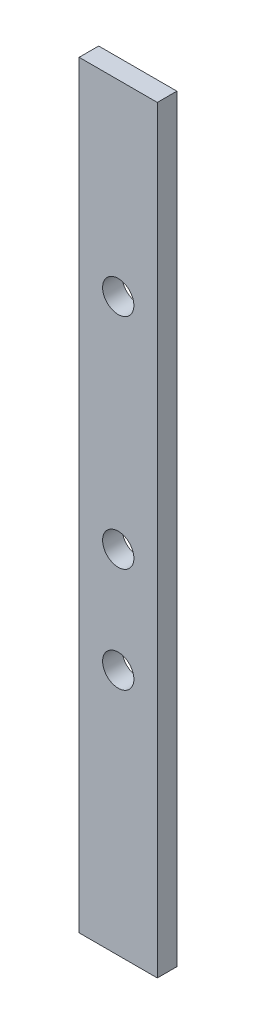
ISO-10303-21;
HEADER;
FILE_DESCRIPTION(('STEP AP214'),'2;1');
FILE_NAME('part.step','',(''),(''),'','','');
FILE_SCHEMA(('AUTOMOTIVE_DESIGN { 1 0 10303 214 1 1 1 1 }'));
ENDSEC;
DATA;
#1=APPLICATION_CONTEXT('core data for automotive mechanical design processes');
#2=APPLICATION_PROTOCOL_DEFINITION('international standard','automotive_design',2000,#1);
#3=PRODUCT_CONTEXT('',#1,'mechanical');
#4=PRODUCT('Part','Part','',(#3));
#5=PRODUCT_RELATED_PRODUCT_CATEGORY('part','',(#4));
#6=PRODUCT_DEFINITION_FORMATION('','',#4);
#7=PRODUCT_DEFINITION_CONTEXT('part definition',#1,'design');
#8=PRODUCT_DEFINITION('design','',#6,#7);
#9=PRODUCT_DEFINITION_SHAPE('','',#8);
#10=(LENGTH_UNIT() NAMED_UNIT(*) SI_UNIT(.MILLI.,.METRE.));
#11=(NAMED_UNIT(*) PLANE_ANGLE_UNIT() SI_UNIT($,.RADIAN.));
#12=(NAMED_UNIT(*) SI_UNIT($,.STERADIAN.) SOLID_ANGLE_UNIT());
#13=UNCERTAINTY_MEASURE_WITH_UNIT(LENGTH_MEASURE(1.E-05),#10,'distance_accuracy_value','');
#14=(GEOMETRIC_REPRESENTATION_CONTEXT(3) GLOBAL_UNCERTAINTY_ASSIGNED_CONTEXT((#13)) GLOBAL_UNIT_ASSIGNED_CONTEXT((#10,
#11,#12)) REPRESENTATION_CONTEXT('',''));
#15=CARTESIAN_POINT('',(0.,0.,0.));
#16=DIRECTION('',(0.,0.,1.));
#17=DIRECTION('',(1.,0.,0.));
#18=AXIS2_PLACEMENT_3D('',#15,#16,#17);
#19=CARTESIAN_POINT('',(0.,123.19,0.));
#20=DIRECTION('',(1.,0.,0.));
#21=DIRECTION('',(0.,0.,-1.));
#22=AXIS2_PLACEMENT_3D('',#19,#20,#21);
#23=PLANE('',#22);
#24=DIRECTION('',(0.,0.,1.));
#25=VECTOR('',#24,1.);
#26=CARTESIAN_POINT('',(0.,0.,0.));
#27=LINE('',#26,#25);
#28=CARTESIAN_POINT('',(0.,0.,-3.175));
#29=VERTEX_POINT('',#28);
#30=CARTESIAN_POINT('',(0.,0.,0.));
#31=VERTEX_POINT('',#30);
#32=EDGE_CURVE('E116',#29,#31,#27,.T.);
#33=ORIENTED_EDGE('',*,*,#32,.T.);
#34=DIRECTION('',(0.,-1.,0.));
#35=VECTOR('',#34,1.);
#36=CARTESIAN_POINT('',(0.,123.19,0.));
#37=LINE('',#36,#35);
#38=CARTESIAN_POINT('',(0.,123.19,0.));
#39=VERTEX_POINT('',#38);
#40=EDGE_CURVE('E11',#39,#31,#37,.T.);
#41=ORIENTED_EDGE('',*,*,#40,.F.);
#42=DIRECTION('',(0.,0.,1.));
#43=VECTOR('',#42,1.);
#44=CARTESIAN_POINT('',(0.,123.19,0.));
#45=LINE('',#44,#43);
#46=CARTESIAN_POINT('',(0.,123.19,-3.175));
#47=VERTEX_POINT('',#46);
#48=EDGE_CURVE('E99',#47,#39,#45,.T.);
#49=ORIENTED_EDGE('',*,*,#48,.F.);
#50=DIRECTION('',(0.,-1.,0.));
#51=VECTOR('',#50,1.);
#52=CARTESIAN_POINT('',(0.,123.19,-3.175));
#53=LINE('',#52,#51);
#54=EDGE_CURVE('E112',#47,#29,#53,.T.);
#55=ORIENTED_EDGE('',*,*,#54,.T.);
#56=EDGE_LOOP('',(#33,#41,#49,#55));
#57=FACE_BOUND('',#56,.T.);
#58=ADVANCED_FACE('F45',(#57),#23,.F.);
#59=CARTESIAN_POINT('',(0.,123.19,0.));
#60=DIRECTION('',(0.,0.,-1.));
#61=DIRECTION('',(-1.,0.,0.));
#62=AXIS2_PLACEMENT_3D('',#59,#60,#61);
#63=PLANE('',#62);
#64=CARTESIAN_POINT('',(6.35,92.71,0.));
#65=DIRECTION('',(0.,0.,1.));
#66=DIRECTION('',(1.,0.,0.));
#67=AXIS2_PLACEMENT_3D('',#64,#65,#66);
#68=CIRCLE('',#67,2.54);
#69=CARTESIAN_POINT('',(8.89,92.71,0.));
#70=VERTEX_POINT('',#69);
#71=EDGE_CURVE('E134',#70,#70,#68,.T.);
#72=ORIENTED_EDGE('',*,*,#71,.F.);
#73=EDGE_LOOP('',(#72));
#74=FACE_BOUND('',#73,.T.);
#75=CARTESIAN_POINT('',(6.35000000000002,57.15,0.));
#76=DIRECTION('',(0.,0.,1.));
#77=DIRECTION('',(1.,0.,0.));
#78=AXIS2_PLACEMENT_3D('',#75,#76,#77);
#79=CIRCLE('',#78,2.54);
#80=CARTESIAN_POINT('',(8.89000000000002,57.15,0.));
#81=VERTEX_POINT('',#80);
#82=EDGE_CURVE('E235',#81,#81,#79,.T.);
#83=ORIENTED_EDGE('',*,*,#82,.F.);
#84=EDGE_LOOP('',(#83));
#85=FACE_BOUND('',#84,.T.);
#86=CARTESIAN_POINT('',(6.35000000000002,40.132,0.));
#87=DIRECTION('',(0.,0.,1.));
#88=DIRECTION('',(1.,0.,0.));
#89=AXIS2_PLACEMENT_3D('',#86,#87,#88);
#90=CIRCLE('',#89,2.54);
#91=CARTESIAN_POINT('',(8.89000000000002,40.132,0.));
#92=VERTEX_POINT('',#91);
#93=EDGE_CURVE('E230',#92,#92,#90,.T.);
#94=ORIENTED_EDGE('',*,*,#93,.F.);
#95=EDGE_LOOP('',(#94));
#96=FACE_BOUND('',#95,.T.);
#97=DIRECTION('',(1.,0.,0.));
#98=VECTOR('',#97,1.);
#99=CARTESIAN_POINT('',(0.,0.,0.));
#100=LINE('',#99,#98);
#101=CARTESIAN_POINT('',(12.7,0.,0.));
#102=VERTEX_POINT('',#101);
#103=EDGE_CURVE('E104',#31,#102,#100,.T.);
#104=ORIENTED_EDGE('',*,*,#103,.T.);
#105=DIRECTION('',(0.,-1.,0.));
#106=VECTOR('',#105,1.);
#107=CARTESIAN_POINT('',(12.7,123.19,0.));
#108=LINE('',#107,#106);
#109=CARTESIAN_POINT('',(12.7,123.19,0.));
#110=VERTEX_POINT('',#109);
#111=EDGE_CURVE('E55',#110,#102,#108,.T.);
#112=ORIENTED_EDGE('',*,*,#111,.F.);
#113=DIRECTION('',(1.,0.,0.));
#114=VECTOR('',#113,1.);
#115=CARTESIAN_POINT('',(0.,123.19,0.));
#116=LINE('',#115,#114);
#117=EDGE_CURVE('E94',#39,#110,#116,.T.);
#118=ORIENTED_EDGE('',*,*,#117,.F.);
#119=ORIENTED_EDGE('',*,*,#40,.T.);
#120=EDGE_LOOP('',(#104,#112,#118,#119));
#121=FACE_BOUND('',#120,.T.);
#122=ADVANCED_FACE('F103',(#74,#85,#96,#121),#63,.F.);
#123=CARTESIAN_POINT('',(12.7,123.19,0.));
#124=DIRECTION('',(-1.,0.,0.));
#125=DIRECTION('',(0.,0.,1.));
#126=AXIS2_PLACEMENT_3D('',#123,#124,#125);
#127=PLANE('',#126);
#128=DIRECTION('',(0.,0.,-1.));
#129=VECTOR('',#128,1.);
#130=CARTESIAN_POINT('',(12.7,0.,0.));
#131=LINE('',#130,#129);
#132=CARTESIAN_POINT('',(12.7,0.,-3.175));
#133=VERTEX_POINT('',#132);
#134=EDGE_CURVE('E81',#102,#133,#131,.T.);
#135=ORIENTED_EDGE('',*,*,#134,.T.);
#136=DIRECTION('',(0.,-1.,0.));
#137=VECTOR('',#136,1.);
#138=CARTESIAN_POINT('',(12.7,123.19,-3.175));
#139=LINE('',#138,#137);
#140=CARTESIAN_POINT('',(12.7,123.19,-3.175));
#141=VERTEX_POINT('',#140);
#142=EDGE_CURVE('E106',#141,#133,#139,.T.);
#143=ORIENTED_EDGE('',*,*,#142,.F.);
#144=DIRECTION('',(0.,0.,-1.));
#145=VECTOR('',#144,1.);
#146=CARTESIAN_POINT('',(12.7,123.19,0.));
#147=LINE('',#146,#145);
#148=EDGE_CURVE('E97',#110,#141,#147,.T.);
#149=ORIENTED_EDGE('',*,*,#148,.F.);
#150=ORIENTED_EDGE('',*,*,#111,.T.);
#151=EDGE_LOOP('',(#135,#143,#149,#150));
#152=FACE_BOUND('',#151,.T.);
#153=ADVANCED_FACE('F108',(#152),#127,.F.);
#154=CARTESIAN_POINT('',(0.,123.19,-3.175));
#155=DIRECTION('',(0.,0.,1.));
#156=DIRECTION('',(1.,0.,0.));
#157=AXIS2_PLACEMENT_3D('',#154,#155,#156);
#158=PLANE('',#157);
#159=CARTESIAN_POINT('',(6.35,92.71,-3.175));
#160=DIRECTION('',(0.,0.,1.));
#161=DIRECTION('',(1.,0.,0.));
#162=AXIS2_PLACEMENT_3D('',#159,#160,#161);
#163=CIRCLE('',#162,2.54);
#164=CARTESIAN_POINT('',(8.89,92.71,-3.175));
#165=VERTEX_POINT('',#164);
#166=EDGE_CURVE('E48',#165,#165,#163,.T.);
#167=ORIENTED_EDGE('',*,*,#166,.T.);
#168=EDGE_LOOP('',(#167));
#169=FACE_BOUND('',#168,.T.);
#170=CARTESIAN_POINT('',(6.35000000000002,57.15,-3.175));
#171=DIRECTION('',(0.,0.,1.));
#172=DIRECTION('',(1.,0.,0.));
#173=AXIS2_PLACEMENT_3D('',#170,#171,#172);
#174=CIRCLE('',#173,2.54);
#175=CARTESIAN_POINT('',(8.89000000000002,57.15,-3.175));
#176=VERTEX_POINT('',#175);
#177=EDGE_CURVE('E133',#176,#176,#174,.T.);
#178=ORIENTED_EDGE('',*,*,#177,.T.);
#179=EDGE_LOOP('',(#178));
#180=FACE_BOUND('',#179,.T.);
#181=CARTESIAN_POINT('',(6.35000000000002,40.132,-3.175));
#182=DIRECTION('',(0.,0.,1.));
#183=DIRECTION('',(1.,0.,0.));
#184=AXIS2_PLACEMENT_3D('',#181,#182,#183);
#185=CIRCLE('',#184,2.54);
#186=CARTESIAN_POINT('',(8.89000000000002,40.132,-3.175));
#187=VERTEX_POINT('',#186);
#188=EDGE_CURVE('E130',#187,#187,#185,.T.);
#189=ORIENTED_EDGE('',*,*,#188,.T.);
#190=EDGE_LOOP('',(#189));
#191=FACE_BOUND('',#190,.T.);
#192=DIRECTION('',(-1.,0.,0.));
#193=VECTOR('',#192,1.);
#194=CARTESIAN_POINT('',(0.,0.,-3.175));
#195=LINE('',#194,#193);
#196=EDGE_CURVE('E87',#133,#29,#195,.T.);
#197=ORIENTED_EDGE('',*,*,#196,.T.);
#198=ORIENTED_EDGE('',*,*,#54,.F.);
#199=DIRECTION('',(-1.,0.,0.));
#200=VECTOR('',#199,1.);
#201=CARTESIAN_POINT('',(0.,123.19,-3.175));
#202=LINE('',#201,#200);
#203=EDGE_CURVE('E64',#141,#47,#202,.T.);
#204=ORIENTED_EDGE('',*,*,#203,.F.);
#205=ORIENTED_EDGE('',*,*,#142,.T.);
#206=EDGE_LOOP('',(#197,#198,#204,#205));
#207=FACE_BOUND('',#206,.T.);
#208=ADVANCED_FACE('F143',(#169,#180,#191,#207),#158,.F.);
#209=CARTESIAN_POINT('',(0.,123.19,0.));
#210=DIRECTION('',(0.,-1.,0.));
#211=DIRECTION('',(0.,0.,-1.));
#212=AXIS2_PLACEMENT_3D('',#209,#210,#211);
#213=PLANE('',#212);
#214=ORIENTED_EDGE('',*,*,#48,.T.);
#215=ORIENTED_EDGE('',*,*,#117,.T.);
#216=ORIENTED_EDGE('',*,*,#148,.T.);
#217=ORIENTED_EDGE('',*,*,#203,.T.);
#218=EDGE_LOOP('',(#214,#215,#216,#217));
#219=FACE_BOUND('',#218,.T.);
#220=ADVANCED_FACE('F95',(#219),#213,.F.);
#221=CARTESIAN_POINT('',(0.,0.,0.));
#222=DIRECTION('',(0.,-1.,0.));
#223=DIRECTION('',(0.,0.,-1.));
#224=AXIS2_PLACEMENT_3D('',#221,#222,#223);
#225=PLANE('',#224);
#226=ORIENTED_EDGE('',*,*,#32,.F.);
#227=ORIENTED_EDGE('',*,*,#196,.F.);
#228=ORIENTED_EDGE('',*,*,#134,.F.);
#229=ORIENTED_EDGE('',*,*,#103,.F.);
#230=EDGE_LOOP('',(#226,#227,#228,#229));
#231=FACE_BOUND('',#230,.T.);
#232=ADVANCED_FACE('F166',(#231),#225,.T.);
#233=CARTESIAN_POINT('',(6.35000000000002,40.132,-25.4));
#234=DIRECTION('',(0.,0.,1.));
#235=DIRECTION('',(1.,0.,0.));
#236=AXIS2_PLACEMENT_3D('',#233,#234,#235);
#237=CYLINDRICAL_SURFACE('',#236,2.54);
#238=ORIENTED_EDGE('',*,*,#93,.T.);
#239=EDGE_LOOP('',(#238));
#240=FACE_BOUND('',#239,.T.);
#241=ORIENTED_EDGE('',*,*,#188,.F.);
#242=EDGE_LOOP('',(#241));
#243=FACE_BOUND('',#242,.T.);
#244=ADVANCED_FACE('F153',(#240,#243),#237,.F.);
#245=CARTESIAN_POINT('',(6.35000000000002,57.15,-25.4));
#246=DIRECTION('',(0.,0.,1.));
#247=DIRECTION('',(1.,0.,0.));
#248=AXIS2_PLACEMENT_3D('',#245,#246,#247);
#249=CYLINDRICAL_SURFACE('',#248,2.54);
#250=ORIENTED_EDGE('',*,*,#82,.T.);
#251=EDGE_LOOP('',(#250));
#252=FACE_BOUND('',#251,.T.);
#253=ORIENTED_EDGE('',*,*,#177,.F.);
#254=EDGE_LOOP('',(#253));
#255=FACE_BOUND('',#254,.T.);
#256=ADVANCED_FACE('F147',(#252,#255),#249,.F.);
#257=CARTESIAN_POINT('',(6.35,92.71,-25.4));
#258=DIRECTION('',(0.,0.,1.));
#259=DIRECTION('',(1.,0.,0.));
#260=AXIS2_PLACEMENT_3D('',#257,#258,#259);
#261=CYLINDRICAL_SURFACE('',#260,2.54);
#262=ORIENTED_EDGE('',*,*,#71,.T.);
#263=EDGE_LOOP('',(#262));
#264=FACE_BOUND('',#263,.T.);
#265=ORIENTED_EDGE('',*,*,#166,.F.);
#266=EDGE_LOOP('',(#265));
#267=FACE_BOUND('',#266,.T.);
#268=ADVANCED_FACE('F145',(#264,#267),#261,.F.);
#269=CLOSED_SHELL('',(#58,#122,#153,#208,#220,#232,#244,#256,#268));
#270=MANIFOLD_SOLID_BREP('B2',#269);
#271=ADVANCED_BREP_SHAPE_REPRESENTATION('',(#18,#270),#14);
#272=SHAPE_DEFINITION_REPRESENTATION(#9,#271);
ENDSEC;
END-ISO-10303-21;
